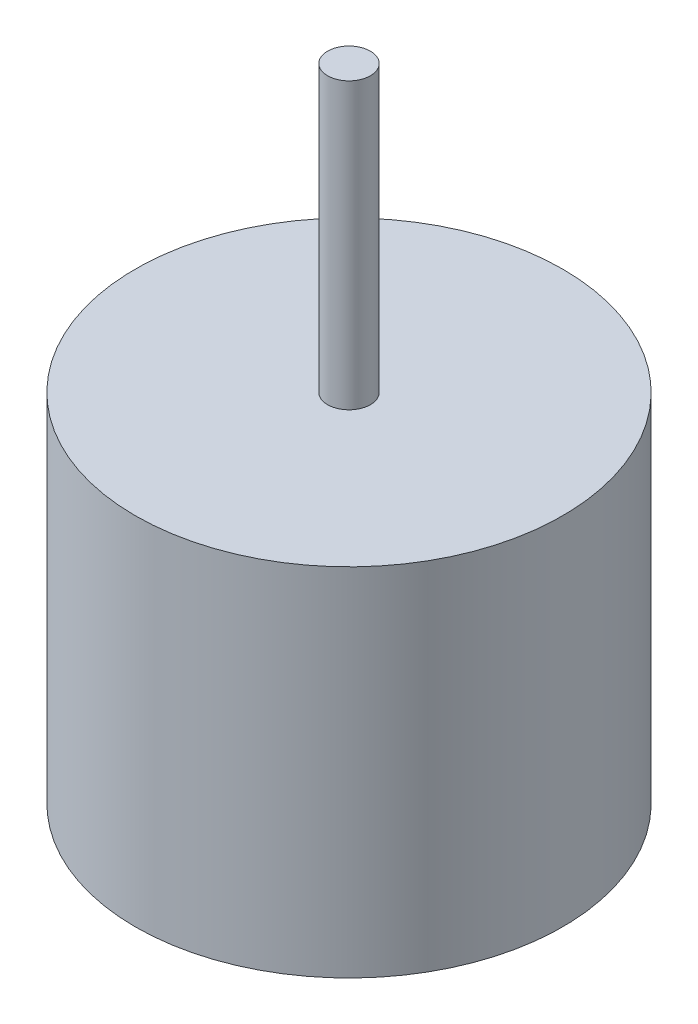
ISO-10303-21;
HEADER;
FILE_DESCRIPTION(('STEP AP214'),'2;1');
FILE_NAME('part.step','',(''),(''),'','','');
FILE_SCHEMA(('AUTOMOTIVE_DESIGN { 1 0 10303 214 1 1 1 1 }'));
ENDSEC;
DATA;
#1=APPLICATION_CONTEXT('core data for automotive mechanical design processes');
#2=APPLICATION_PROTOCOL_DEFINITION('international standard','automotive_design',2000,#1);
#3=PRODUCT_CONTEXT('',#1,'mechanical');
#4=PRODUCT('Part','Part','',(#3));
#5=PRODUCT_RELATED_PRODUCT_CATEGORY('part','',(#4));
#6=PRODUCT_DEFINITION_FORMATION('','',#4);
#7=PRODUCT_DEFINITION_CONTEXT('part definition',#1,'design');
#8=PRODUCT_DEFINITION('design','',#6,#7);
#9=PRODUCT_DEFINITION_SHAPE('','',#8);
#10=(LENGTH_UNIT() NAMED_UNIT(*) SI_UNIT(.MILLI.,.METRE.));
#11=(NAMED_UNIT(*) PLANE_ANGLE_UNIT() SI_UNIT($,.RADIAN.));
#12=(NAMED_UNIT(*) SI_UNIT($,.STERADIAN.) SOLID_ANGLE_UNIT());
#13=UNCERTAINTY_MEASURE_WITH_UNIT(LENGTH_MEASURE(1.E-05),#10,'distance_accuracy_value','');
#14=(GEOMETRIC_REPRESENTATION_CONTEXT(3) GLOBAL_UNCERTAINTY_ASSIGNED_CONTEXT((#13)) GLOBAL_UNIT_ASSIGNED_CONTEXT((#10,
#11,#12)) REPRESENTATION_CONTEXT('',''));
#15=CARTESIAN_POINT('',(0.,0.,0.));
#16=DIRECTION('',(0.,0.,1.));
#17=DIRECTION('',(1.,0.,0.));
#18=AXIS2_PLACEMENT_3D('',#15,#16,#17);
#19=CARTESIAN_POINT('',(0.,25.,0.));
#20=DIRECTION('',(0.,1.,0.));
#21=DIRECTION('',(0.,0.,1.));
#22=AXIS2_PLACEMENT_3D('',#19,#20,#21);
#23=PLANE('',#22);
#24=CARTESIAN_POINT('',(0.,25.,0.));
#25=DIRECTION('',(0.,1.,0.));
#26=DIRECTION('',(0.,0.,1.));
#27=AXIS2_PLACEMENT_3D('',#24,#25,#26);
#28=CIRCLE('',#27,15.);
#29=CARTESIAN_POINT('',(0.,25.,15.));
#30=VERTEX_POINT('',#29);
#31=EDGE_CURVE('E10',#30,#30,#28,.T.);
#32=ORIENTED_EDGE('',*,*,#31,.T.);
#33=EDGE_LOOP('',(#32));
#34=FACE_BOUND('',#33,.T.);
#35=CARTESIAN_POINT('',(0.,25.,0.));
#36=DIRECTION('',(0.,1.,0.));
#37=DIRECTION('',(0.,0.,1.));
#38=AXIS2_PLACEMENT_3D('',#35,#36,#37);
#39=CIRCLE('',#38,1.5);
#40=CARTESIAN_POINT('',(0.,25.,1.5));
#41=VERTEX_POINT('',#40);
#42=EDGE_CURVE('E50',#41,#41,#39,.T.);
#43=ORIENTED_EDGE('',*,*,#42,.F.);
#44=EDGE_LOOP('',(#43));
#45=FACE_BOUND('',#44,.T.);
#46=ADVANCED_FACE('F37',(#34,#45),#23,.T.);
#47=CARTESIAN_POINT('',(0.,0.,0.));
#48=DIRECTION('',(0.,1.,0.));
#49=DIRECTION('',(0.,0.,1.));
#50=AXIS2_PLACEMENT_3D('',#47,#48,#49);
#51=PLANE('',#50);
#52=CARTESIAN_POINT('',(0.,0.,0.));
#53=DIRECTION('',(0.,1.,0.));
#54=DIRECTION('',(0.,0.,1.));
#55=AXIS2_PLACEMENT_3D('',#52,#53,#54);
#56=CIRCLE('',#55,15.);
#57=CARTESIAN_POINT('',(0.,0.,15.));
#58=VERTEX_POINT('',#57);
#59=EDGE_CURVE('E41',#58,#58,#56,.T.);
#60=ORIENTED_EDGE('',*,*,#59,.F.);
#61=EDGE_LOOP('',(#60));
#62=FACE_BOUND('',#61,.T.);
#63=ADVANCED_FACE('F71',(#62),#51,.F.);
#64=CARTESIAN_POINT('',(0.,25.,0.));
#65=DIRECTION('',(0.,-1.,0.));
#66=DIRECTION('',(0.,0.,-1.));
#67=AXIS2_PLACEMENT_3D('',#64,#65,#66);
#68=CYLINDRICAL_SURFACE('',#67,15.);
#69=ORIENTED_EDGE('',*,*,#31,.F.);
#70=EDGE_LOOP('',(#69));
#71=FACE_BOUND('',#70,.T.);
#72=ORIENTED_EDGE('',*,*,#59,.T.);
#73=EDGE_LOOP('',(#72));
#74=FACE_BOUND('',#73,.T.);
#75=ADVANCED_FACE('F39',(#71,#74),#68,.T.);
#76=CARTESIAN_POINT('',(0.,0.,0.));
#77=DIRECTION('',(0.,1.,0.));
#78=DIRECTION('',(0.,0.,1.));
#79=AXIS2_PLACEMENT_3D('',#76,#77,#78);
#80=CYLINDRICAL_SURFACE('',#79,1.5);
#81=ORIENTED_EDGE('',*,*,#42,.T.);
#82=EDGE_LOOP('',(#81));
#83=FACE_BOUND('',#82,.T.);
#84=CARTESIAN_POINT('',(0.,45.,0.));
#85=DIRECTION('',(0.,1.,0.));
#86=DIRECTION('',(0.,0.,1.));
#87=AXIS2_PLACEMENT_3D('',#84,#85,#86);
#88=CIRCLE('',#87,1.5);
#89=CARTESIAN_POINT('',(0.,45.,1.5));
#90=VERTEX_POINT('',#89);
#91=EDGE_CURVE('E55',#90,#90,#88,.T.);
#92=ORIENTED_EDGE('',*,*,#91,.F.);
#93=EDGE_LOOP('',(#92));
#94=FACE_BOUND('',#93,.T.);
#95=ADVANCED_FACE('F62',(#83,#94),#80,.T.);
#96=CARTESIAN_POINT('',(0.,45.,0.));
#97=DIRECTION('',(0.,1.,0.));
#98=DIRECTION('',(0.,0.,1.));
#99=AXIS2_PLACEMENT_3D('',#96,#97,#98);
#100=PLANE('',#99);
#101=ORIENTED_EDGE('',*,*,#91,.T.);
#102=EDGE_LOOP('',(#101));
#103=FACE_BOUND('',#102,.T.);
#104=ADVANCED_FACE('F60',(#103),#100,.T.);
#105=CLOSED_SHELL('',(#46,#63,#75,#95,#104));
#106=MANIFOLD_SOLID_BREP('B2',#105);
#107=ADVANCED_BREP_SHAPE_REPRESENTATION('',(#18,#106),#14);
#108=SHAPE_DEFINITION_REPRESENTATION(#9,#107);
ENDSEC;
END-ISO-10303-21;
